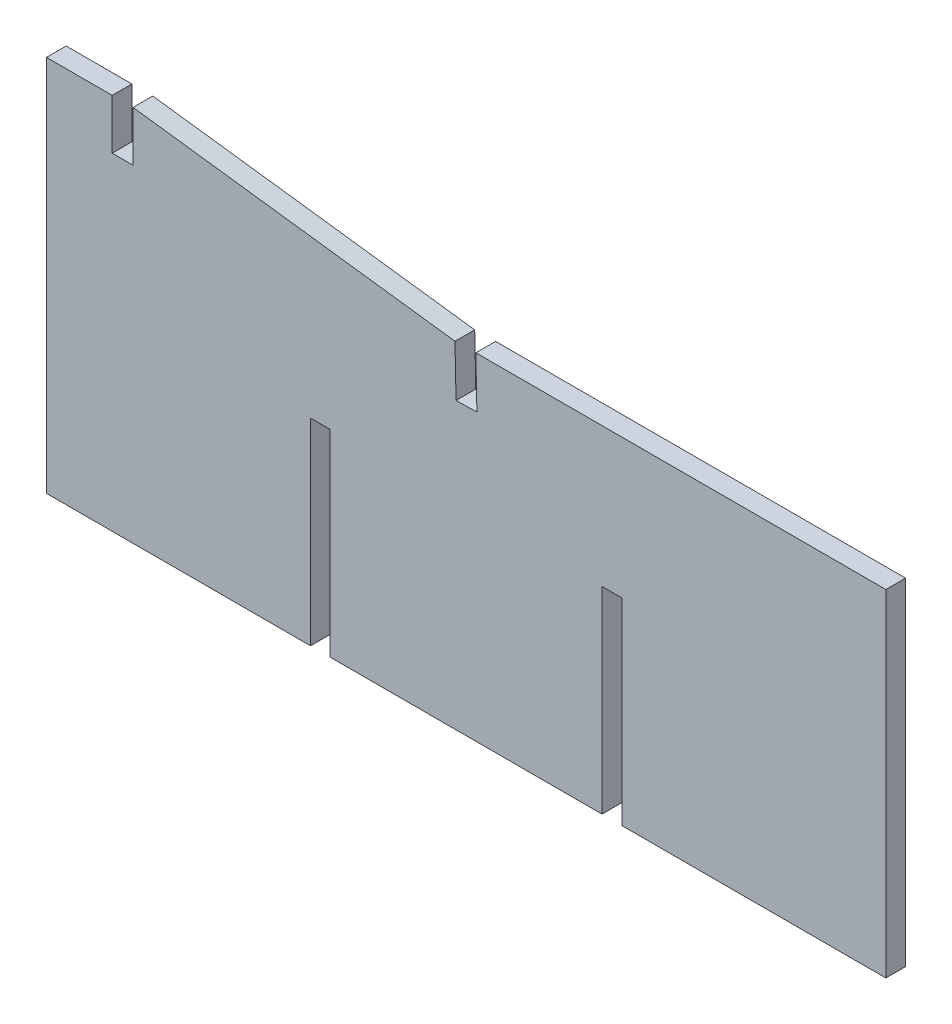
ISO-10303-21;
HEADER;
FILE_DESCRIPTION(('STEP AP214'),'2;1');
FILE_NAME('part.step','',(''),(''),'','','');
FILE_SCHEMA(('AUTOMOTIVE_DESIGN { 1 0 10303 214 1 1 1 1 }'));
ENDSEC;
DATA;
#1=APPLICATION_CONTEXT('core data for automotive mechanical design processes');
#2=APPLICATION_PROTOCOL_DEFINITION('international standard','automotive_design',2000,#1);
#3=PRODUCT_CONTEXT('',#1,'mechanical');
#4=PRODUCT('Part','Part','',(#3));
#5=PRODUCT_RELATED_PRODUCT_CATEGORY('part','',(#4));
#6=PRODUCT_DEFINITION_FORMATION('','',#4);
#7=PRODUCT_DEFINITION_CONTEXT('part definition',#1,'design');
#8=PRODUCT_DEFINITION('design','',#6,#7);
#9=PRODUCT_DEFINITION_SHAPE('','',#8);
#10=(LENGTH_UNIT() NAMED_UNIT(*) SI_UNIT(.MILLI.,.METRE.));
#11=(NAMED_UNIT(*) PLANE_ANGLE_UNIT() SI_UNIT($,.RADIAN.));
#12=(NAMED_UNIT(*) SI_UNIT($,.STERADIAN.) SOLID_ANGLE_UNIT());
#13=UNCERTAINTY_MEASURE_WITH_UNIT(LENGTH_MEASURE(1.E-05),#10,'distance_accuracy_value','');
#14=(GEOMETRIC_REPRESENTATION_CONTEXT(3) GLOBAL_UNCERTAINTY_ASSIGNED_CONTEXT((#13)) GLOBAL_UNIT_ASSIGNED_CONTEXT((#10,
#11,#12)) REPRESENTATION_CONTEXT('',''));
#15=CARTESIAN_POINT('',(0.,0.,0.));
#16=DIRECTION('',(0.,0.,1.));
#17=DIRECTION('',(1.,0.,0.));
#18=AXIS2_PLACEMENT_3D('',#15,#16,#17);
#19=CARTESIAN_POINT('',(256.67648980478,83.2463071232041,-193.));
#20=DIRECTION('',(0.,-1.,0.));
#21=DIRECTION('',(0.,0.,-1.));
#22=AXIS2_PLACEMENT_3D('',#19,#20,#21);
#23=PLANE('',#22);
#24=DIRECTION('',(-1.,0.,0.));
#25=VECTOR('',#24,1.);
#26=CARTESIAN_POINT('',(256.67648980478,83.2463071232041,-196.));
#27=LINE('',#26,#25);
#28=CARTESIAN_POINT('',(266.67648980478,83.2463071232041,-196.));
#29=VERTEX_POINT('',#28);
#30=CARTESIAN_POINT('',(256.67648980478,83.2463071232041,-196.));
#31=VERTEX_POINT('',#30);
#32=EDGE_CURVE('E201',#29,#31,#27,.T.);
#33=ORIENTED_EDGE('',*,*,#32,.T.);
#34=DIRECTION('',(0.,0.,-1.));
#35=VECTOR('',#34,1.);
#36=CARTESIAN_POINT('',(256.67648980478,83.2463071232041,-193.));
#37=LINE('',#36,#35);
#38=CARTESIAN_POINT('',(256.67648980478,83.2463071232041,-193.));
#39=VERTEX_POINT('',#38);
#40=EDGE_CURVE('E11',#39,#31,#37,.T.);
#41=ORIENTED_EDGE('',*,*,#40,.F.);
#42=DIRECTION('',(-1.,0.,0.));
#43=VECTOR('',#42,1.);
#44=CARTESIAN_POINT('',(256.67648980478,83.2463071232041,-193.));
#45=LINE('',#44,#43);
#46=CARTESIAN_POINT('',(266.67648980478,83.2463071232041,-193.));
#47=VERTEX_POINT('',#46);
#48=EDGE_CURVE('E239',#47,#39,#45,.T.);
#49=ORIENTED_EDGE('',*,*,#48,.F.);
#50=DIRECTION('',(0.,0.,-1.));
#51=VECTOR('',#50,1.);
#52=CARTESIAN_POINT('',(266.67648980478,83.2463071232041,-193.));
#53=LINE('',#52,#51);
#54=EDGE_CURVE('E197',#47,#29,#53,.T.);
#55=ORIENTED_EDGE('',*,*,#54,.T.);
#56=EDGE_LOOP('',(#33,#41,#49,#55));
#57=FACE_BOUND('',#56,.T.);
#58=ADVANCED_FACE('F33',(#57),#23,.F.);
#59=CARTESIAN_POINT('',(256.67648980478,25.8076428533385,-193.));
#60=DIRECTION('',(1.,0.,0.));
#61=DIRECTION('',(0.,0.,-1.));
#62=AXIS2_PLACEMENT_3D('',#59,#60,#61);
#63=PLANE('',#62);
#64=DIRECTION('',(0.,-1.,0.));
#65=VECTOR('',#64,1.);
#66=CARTESIAN_POINT('',(256.67648980478,25.8076428533385,-196.));
#67=LINE('',#66,#65);
#68=CARTESIAN_POINT('',(256.67648980478,25.8076428533385,-196.));
#69=VERTEX_POINT('',#68);
#70=EDGE_CURVE('E204',#31,#69,#67,.T.);
#71=ORIENTED_EDGE('',*,*,#70,.T.);
#72=DIRECTION('',(0.,0.,-1.));
#73=VECTOR('',#72,1.);
#74=CARTESIAN_POINT('',(256.67648980478,25.8076428533385,-193.));
#75=LINE('',#74,#73);
#76=CARTESIAN_POINT('',(256.67648980478,25.8076428533385,-193.));
#77=VERTEX_POINT('',#76);
#78=EDGE_CURVE('E41',#77,#69,#75,.T.);
#79=ORIENTED_EDGE('',*,*,#78,.F.);
#80=DIRECTION('',(0.,-1.,0.));
#81=VECTOR('',#80,1.);
#82=CARTESIAN_POINT('',(256.67648980478,25.8076428533385,-193.));
#83=LINE('',#82,#81);
#84=EDGE_CURVE('E128',#39,#77,#83,.T.);
#85=ORIENTED_EDGE('',*,*,#84,.F.);
#86=ORIENTED_EDGE('',*,*,#40,.T.);
#87=EDGE_LOOP('',(#71,#79,#85,#86));
#88=FACE_BOUND('',#87,.T.);
#89=ADVANCED_FACE('F357',(#88),#63,.F.);
#90=CARTESIAN_POINT('',(296.85148980478,25.8076428533385,-193.));
#91=DIRECTION('',(0.,1.,0.));
#92=DIRECTION('',(-1.,0.,0.));
#93=AXIS2_PLACEMENT_3D('',#90,#91,#92);
#94=PLANE('',#93);
#95=DIRECTION('',(1.,0.,0.));
#96=VECTOR('',#95,1.);
#97=CARTESIAN_POINT('',(296.85148980478,25.8076428533385,-196.));
#98=LINE('',#97,#96);
#99=CARTESIAN_POINT('',(296.85148980478,25.8076428533385,-196.));
#100=VERTEX_POINT('',#99);
#101=EDGE_CURVE('E206',#69,#100,#98,.T.);
#102=ORIENTED_EDGE('',*,*,#101,.T.);
#103=DIRECTION('',(0.,0.,-1.));
#104=VECTOR('',#103,1.);
#105=CARTESIAN_POINT('',(296.85148980478,25.8076428533385,-193.));
#106=LINE('',#105,#104);
#107=CARTESIAN_POINT('',(296.85148980478,25.8076428533385,-193.));
#108=VERTEX_POINT('',#107);
#109=EDGE_CURVE('E282',#108,#100,#106,.T.);
#110=ORIENTED_EDGE('',*,*,#109,.F.);
#111=DIRECTION('',(1.,0.,0.));
#112=VECTOR('',#111,1.);
#113=CARTESIAN_POINT('',(296.85148980478,25.8076428533385,-193.));
#114=LINE('',#113,#112);
#115=EDGE_CURVE('E290',#77,#108,#114,.T.);
#116=ORIENTED_EDGE('',*,*,#115,.F.);
#117=ORIENTED_EDGE('',*,*,#78,.T.);
#118=EDGE_LOOP('',(#102,#110,#116,#117));
#119=FACE_BOUND('',#118,.T.);
#120=ADVANCED_FACE('F288',(#119),#94,.F.);
#121=CARTESIAN_POINT('',(296.85148980478,25.8076428533385,-193.));
#122=DIRECTION('',(-1.,0.,0.));
#123=DIRECTION('',(0.,0.,1.));
#124=AXIS2_PLACEMENT_3D('',#121,#122,#123);
#125=PLANE('',#124);
#126=DIRECTION('',(0.,1.,0.));
#127=VECTOR('',#126,1.);
#128=CARTESIAN_POINT('',(296.85148980478,25.8076428533385,-196.));
#129=LINE('',#128,#127);
#130=CARTESIAN_POINT('',(296.85148980478,55.8076428533385,-196.));
#131=VERTEX_POINT('',#130);
#132=EDGE_CURVE('E208',#100,#131,#129,.T.);
#133=ORIENTED_EDGE('',*,*,#132,.T.);
#134=DIRECTION('',(0.,0.,-1.));
#135=VECTOR('',#134,1.);
#136=CARTESIAN_POINT('',(296.85148980478,55.8076428533385,-193.));
#137=LINE('',#136,#135);
#138=CARTESIAN_POINT('',(296.85148980478,55.8076428533385,-193.));
#139=VERTEX_POINT('',#138);
#140=EDGE_CURVE('E279',#139,#131,#137,.T.);
#141=ORIENTED_EDGE('',*,*,#140,.F.);
#142=DIRECTION('',(0.,1.,0.));
#143=VECTOR('',#142,1.);
#144=CARTESIAN_POINT('',(296.85148980478,25.8076428533385,-193.));
#145=LINE('',#144,#143);
#146=EDGE_CURVE('E308',#108,#139,#145,.T.);
#147=ORIENTED_EDGE('',*,*,#146,.F.);
#148=ORIENTED_EDGE('',*,*,#109,.T.);
#149=EDGE_LOOP('',(#133,#141,#147,#148));
#150=FACE_BOUND('',#149,.T.);
#151=ADVANCED_FACE('F299',(#150),#125,.F.);
#152=CARTESIAN_POINT('',(296.85148980478,55.8076428533385,-193.));
#153=DIRECTION('',(0.,1.,0.));
#154=DIRECTION('',(0.,0.,1.));
#155=AXIS2_PLACEMENT_3D('',#152,#153,#154);
#156=PLANE('',#155);
#157=DIRECTION('',(1.,0.,0.));
#158=VECTOR('',#157,1.);
#159=CARTESIAN_POINT('',(296.85148980478,55.8076428533385,-196.));
#160=LINE('',#159,#158);
#161=CARTESIAN_POINT('',(299.85148980478,55.8076428533385,-196.));
#162=VERTEX_POINT('',#161);
#163=EDGE_CURVE('E210',#131,#162,#160,.T.);
#164=ORIENTED_EDGE('',*,*,#163,.T.);
#165=DIRECTION('',(0.,0.,-1.));
#166=VECTOR('',#165,1.);
#167=CARTESIAN_POINT('',(299.85148980478,55.8076428533385,-193.));
#168=LINE('',#167,#166);
#169=CARTESIAN_POINT('',(299.85148980478,55.8076428533385,-193.));
#170=VERTEX_POINT('',#169);
#171=EDGE_CURVE('E276',#170,#162,#168,.T.);
#172=ORIENTED_EDGE('',*,*,#171,.F.);
#173=DIRECTION('',(1.,0.,0.));
#174=VECTOR('',#173,1.);
#175=CARTESIAN_POINT('',(296.85148980478,55.8076428533385,-193.));
#176=LINE('',#175,#174);
#177=EDGE_CURVE('E305',#139,#170,#176,.T.);
#178=ORIENTED_EDGE('',*,*,#177,.F.);
#179=ORIENTED_EDGE('',*,*,#140,.T.);
#180=EDGE_LOOP('',(#164,#172,#178,#179));
#181=FACE_BOUND('',#180,.T.);
#182=ADVANCED_FACE('F303',(#181),#156,.F.);
#183=CARTESIAN_POINT('',(299.85148980478,55.8076428533385,-193.));
#184=DIRECTION('',(1.,0.,0.));
#185=DIRECTION('',(0.,0.,-1.));
#186=AXIS2_PLACEMENT_3D('',#183,#184,#185);
#187=PLANE('',#186);
#188=DIRECTION('',(0.,-1.,0.));
#189=VECTOR('',#188,1.);
#190=CARTESIAN_POINT('',(299.85148980478,55.8076428533385,-196.));
#191=LINE('',#190,#189);
#192=CARTESIAN_POINT('',(299.85148980478,25.8076428533385,-196.));
#193=VERTEX_POINT('',#192);
#194=EDGE_CURVE('E212',#162,#193,#191,.T.);
#195=ORIENTED_EDGE('',*,*,#194,.T.);
#196=DIRECTION('',(0.,0.,-1.));
#197=VECTOR('',#196,1.);
#198=CARTESIAN_POINT('',(299.85148980478,25.8076428533385,-193.));
#199=LINE('',#198,#197);
#200=CARTESIAN_POINT('',(299.85148980478,25.8076428533385,-193.));
#201=VERTEX_POINT('',#200);
#202=EDGE_CURVE('E273',#201,#193,#199,.T.);
#203=ORIENTED_EDGE('',*,*,#202,.F.);
#204=DIRECTION('',(0.,-1.,0.));
#205=VECTOR('',#204,1.);
#206=CARTESIAN_POINT('',(299.85148980478,55.8076428533385,-193.));
#207=LINE('',#206,#205);
#208=EDGE_CURVE('E307',#170,#201,#207,.T.);
#209=ORIENTED_EDGE('',*,*,#208,.F.);
#210=ORIENTED_EDGE('',*,*,#171,.T.);
#211=EDGE_LOOP('',(#195,#203,#209,#210));
#212=FACE_BOUND('',#211,.T.);
#213=ADVANCED_FACE('F370',(#212),#187,.F.);
#214=CARTESIAN_POINT('',(341.19748980478,25.8076428533385,-193.));
#215=DIRECTION('',(0.,1.,0.));
#216=DIRECTION('',(-1.,0.,0.));
#217=AXIS2_PLACEMENT_3D('',#214,#215,#216);
#218=PLANE('',#217);
#219=DIRECTION('',(1.,0.,0.));
#220=VECTOR('',#219,1.);
#221=CARTESIAN_POINT('',(341.19748980478,25.8076428533385,-196.));
#222=LINE('',#221,#220);
#223=CARTESIAN_POINT('',(341.19748980478,25.8076428533385,-196.));
#224=VERTEX_POINT('',#223);
#225=EDGE_CURVE('E214',#193,#224,#222,.T.);
#226=ORIENTED_EDGE('',*,*,#225,.T.);
#227=DIRECTION('',(0.,0.,-1.));
#228=VECTOR('',#227,1.);
#229=CARTESIAN_POINT('',(341.19748980478,25.8076428533385,-193.));
#230=LINE('',#229,#228);
#231=CARTESIAN_POINT('',(341.19748980478,25.8076428533385,-193.));
#232=VERTEX_POINT('',#231);
#233=EDGE_CURVE('E270',#232,#224,#230,.T.);
#234=ORIENTED_EDGE('',*,*,#233,.F.);
#235=DIRECTION('',(1.,0.,0.));
#236=VECTOR('',#235,1.);
#237=CARTESIAN_POINT('',(341.19748980478,25.8076428533385,-193.));
#238=LINE('',#237,#236);
#239=EDGE_CURVE('E310',#201,#232,#238,.T.);
#240=ORIENTED_EDGE('',*,*,#239,.F.);
#241=ORIENTED_EDGE('',*,*,#202,.T.);
#242=EDGE_LOOP('',(#226,#234,#240,#241));
#243=FACE_BOUND('',#242,.T.);
#244=ADVANCED_FACE('F373',(#243),#218,.F.);
#245=CARTESIAN_POINT('',(341.19748980478,25.8076428533385,-193.));
#246=DIRECTION('',(-1.,0.,0.));
#247=DIRECTION('',(0.,0.,1.));
#248=AXIS2_PLACEMENT_3D('',#245,#246,#247);
#249=PLANE('',#248);
#250=DIRECTION('',(0.,1.,0.));
#251=VECTOR('',#250,1.);
#252=CARTESIAN_POINT('',(341.19748980478,25.8076428533385,-196.));
#253=LINE('',#252,#251);
#254=CARTESIAN_POINT('',(341.19748980478,55.8076428533385,-196.));
#255=VERTEX_POINT('',#254);
#256=EDGE_CURVE('E216',#224,#255,#253,.T.);
#257=ORIENTED_EDGE('',*,*,#256,.T.);
#258=DIRECTION('',(0.,0.,-1.));
#259=VECTOR('',#258,1.);
#260=CARTESIAN_POINT('',(341.19748980478,55.8076428533385,-193.));
#261=LINE('',#260,#259);
#262=CARTESIAN_POINT('',(341.19748980478,55.8076428533385,-193.));
#263=VERTEX_POINT('',#262);
#264=EDGE_CURVE('E267',#263,#255,#261,.T.);
#265=ORIENTED_EDGE('',*,*,#264,.F.);
#266=DIRECTION('',(0.,1.,0.));
#267=VECTOR('',#266,1.);
#268=CARTESIAN_POINT('',(341.19748980478,25.8076428533385,-193.));
#269=LINE('',#268,#267);
#270=EDGE_CURVE('E316',#232,#263,#269,.T.);
#271=ORIENTED_EDGE('',*,*,#270,.F.);
#272=ORIENTED_EDGE('',*,*,#233,.T.);
#273=EDGE_LOOP('',(#257,#265,#271,#272));
#274=FACE_BOUND('',#273,.T.);
#275=ADVANCED_FACE('F377',(#274),#249,.F.);
#276=CARTESIAN_POINT('',(341.19748980478,55.8076428533385,-193.));
#277=DIRECTION('',(0.,1.,0.));
#278=DIRECTION('',(0.,0.,1.));
#279=AXIS2_PLACEMENT_3D('',#276,#277,#278);
#280=PLANE('',#279);
#281=DIRECTION('',(1.,0.,0.));
#282=VECTOR('',#281,1.);
#283=CARTESIAN_POINT('',(341.19748980478,55.8076428533385,-196.));
#284=LINE('',#283,#282);
#285=CARTESIAN_POINT('',(344.19748980478,55.8076428533385,-196.));
#286=VERTEX_POINT('',#285);
#287=EDGE_CURVE('E218',#255,#286,#284,.T.);
#288=ORIENTED_EDGE('',*,*,#287,.T.);
#289=DIRECTION('',(0.,0.,-1.));
#290=VECTOR('',#289,1.);
#291=CARTESIAN_POINT('',(344.19748980478,55.8076428533385,-193.));
#292=LINE('',#291,#290);
#293=CARTESIAN_POINT('',(344.19748980478,55.8076428533385,-193.));
#294=VERTEX_POINT('',#293);
#295=EDGE_CURVE('E264',#294,#286,#292,.T.);
#296=ORIENTED_EDGE('',*,*,#295,.F.);
#297=DIRECTION('',(1.,0.,0.));
#298=VECTOR('',#297,1.);
#299=CARTESIAN_POINT('',(341.19748980478,55.8076428533385,-193.));
#300=LINE('',#299,#298);
#301=EDGE_CURVE('E318',#263,#294,#300,.T.);
#302=ORIENTED_EDGE('',*,*,#301,.F.);
#303=ORIENTED_EDGE('',*,*,#264,.T.);
#304=EDGE_LOOP('',(#288,#296,#302,#303));
#305=FACE_BOUND('',#304,.T.);
#306=ADVANCED_FACE('F381',(#305),#280,.F.);
#307=CARTESIAN_POINT('',(344.19748980478,55.8076428533385,-193.));
#308=DIRECTION('',(1.,0.,0.));
#309=DIRECTION('',(0.,0.,-1.));
#310=AXIS2_PLACEMENT_3D('',#307,#308,#309);
#311=PLANE('',#310);
#312=DIRECTION('',(0.,-1.,0.));
#313=VECTOR('',#312,1.);
#314=CARTESIAN_POINT('',(344.19748980478,55.8076428533385,-196.));
#315=LINE('',#314,#313);
#316=CARTESIAN_POINT('',(344.19748980478,25.8076428533385,-196.));
#317=VERTEX_POINT('',#316);
#318=EDGE_CURVE('E220',#286,#317,#315,.T.);
#319=ORIENTED_EDGE('',*,*,#318,.T.);
#320=DIRECTION('',(0.,0.,-1.));
#321=VECTOR('',#320,1.);
#322=CARTESIAN_POINT('',(344.19748980478,25.8076428533385,-193.));
#323=LINE('',#322,#321);
#324=CARTESIAN_POINT('',(344.19748980478,25.8076428533385,-193.));
#325=VERTEX_POINT('',#324);
#326=EDGE_CURVE('E261',#325,#317,#323,.T.);
#327=ORIENTED_EDGE('',*,*,#326,.F.);
#328=DIRECTION('',(0.,-1.,0.));
#329=VECTOR('',#328,1.);
#330=CARTESIAN_POINT('',(344.19748980478,55.8076428533385,-193.));
#331=LINE('',#330,#329);
#332=EDGE_CURVE('E320',#294,#325,#331,.T.);
#333=ORIENTED_EDGE('',*,*,#332,.F.);
#334=ORIENTED_EDGE('',*,*,#295,.T.);
#335=EDGE_LOOP('',(#319,#327,#333,#334));
#336=FACE_BOUND('',#335,.T.);
#337=ADVANCED_FACE('F385',(#336),#311,.F.);
#338=CARTESIAN_POINT('',(384.37248980478,25.8076428533385,-193.));
#339=DIRECTION('',(0.,1.,0.));
#340=DIRECTION('',(-1.,0.,0.));
#341=AXIS2_PLACEMENT_3D('',#338,#339,#340);
#342=PLANE('',#341);
#343=DIRECTION('',(1.,0.,0.));
#344=VECTOR('',#343,1.);
#345=CARTESIAN_POINT('',(384.37248980478,25.8076428533385,-196.));
#346=LINE('',#345,#344);
#347=CARTESIAN_POINT('',(384.37248980478,25.8076428533385,-196.));
#348=VERTEX_POINT('',#347);
#349=EDGE_CURVE('E222',#317,#348,#346,.T.);
#350=ORIENTED_EDGE('',*,*,#349,.T.);
#351=DIRECTION('',(0.,0.,-1.));
#352=VECTOR('',#351,1.);
#353=CARTESIAN_POINT('',(384.37248980478,25.8076428533385,-193.));
#354=LINE('',#353,#352);
#355=CARTESIAN_POINT('',(384.37248980478,25.8076428533385,-193.));
#356=VERTEX_POINT('',#355);
#357=EDGE_CURVE('E258',#356,#348,#354,.T.);
#358=ORIENTED_EDGE('',*,*,#357,.F.);
#359=DIRECTION('',(1.,0.,0.));
#360=VECTOR('',#359,1.);
#361=CARTESIAN_POINT('',(384.37248980478,25.8076428533385,-193.));
#362=LINE('',#361,#360);
#363=EDGE_CURVE('E322',#325,#356,#362,.T.);
#364=ORIENTED_EDGE('',*,*,#363,.F.);
#365=ORIENTED_EDGE('',*,*,#326,.T.);
#366=EDGE_LOOP('',(#350,#358,#364,#365));
#367=FACE_BOUND('',#366,.T.);
#368=ADVANCED_FACE('F389',(#367),#342,.F.);
#369=CARTESIAN_POINT('',(384.37248980478,76.9918433876097,-193.));
#370=DIRECTION('',(-1.,0.,0.));
#371=DIRECTION('',(0.,0.,1.));
#372=AXIS2_PLACEMENT_3D('',#369,#370,#371);
#373=PLANE('',#372);
#374=DIRECTION('',(0.,1.,0.));
#375=VECTOR('',#374,1.);
#376=CARTESIAN_POINT('',(384.37248980478,76.9918433876097,-196.));
#377=LINE('',#376,#375);
#378=CARTESIAN_POINT('',(384.37248980478,76.9918433876097,-196.));
#379=VERTEX_POINT('',#378);
#380=EDGE_CURVE('E224',#348,#379,#377,.T.);
#381=ORIENTED_EDGE('',*,*,#380,.T.);
#382=DIRECTION('',(0.,0.,-1.));
#383=VECTOR('',#382,1.);
#384=CARTESIAN_POINT('',(384.37248980478,76.9918433876097,-193.));
#385=LINE('',#384,#383);
#386=CARTESIAN_POINT('',(384.37248980478,76.9918433876097,-193.));
#387=VERTEX_POINT('',#386);
#388=EDGE_CURVE('E255',#387,#379,#385,.T.);
#389=ORIENTED_EDGE('',*,*,#388,.F.);
#390=DIRECTION('',(0.,1.,0.));
#391=VECTOR('',#390,1.);
#392=CARTESIAN_POINT('',(384.37248980478,76.9918433876097,-193.));
#393=LINE('',#392,#391);
#394=EDGE_CURVE('E324',#356,#387,#393,.T.);
#395=ORIENTED_EDGE('',*,*,#394,.F.);
#396=ORIENTED_EDGE('',*,*,#357,.T.);
#397=EDGE_LOOP('',(#381,#389,#395,#396));
#398=FACE_BOUND('',#397,.T.);
#399=ADVANCED_FACE('F393',(#398),#373,.F.);
#400=CARTESIAN_POINT('',(322.001481343776,76.9918433876097,-193.));
#401=DIRECTION('',(0.,-1.,0.));
#402=DIRECTION('',(0.,0.,-1.));
#403=AXIS2_PLACEMENT_3D('',#400,#401,#402);
#404=PLANE('',#403);
#405=DIRECTION('',(-1.,0.,0.));
#406=VECTOR('',#405,1.);
#407=CARTESIAN_POINT('',(322.001481343776,76.9918433876097,-196.));
#408=LINE('',#407,#406);
#409=CARTESIAN_POINT('',(322.001481343776,76.9918433876097,-196.));
#410=VERTEX_POINT('',#409);
#411=EDGE_CURVE('E226',#379,#410,#408,.T.);
#412=ORIENTED_EDGE('',*,*,#411,.T.);
#413=DIRECTION('',(0.,0.,-1.));
#414=VECTOR('',#413,1.);
#415=CARTESIAN_POINT('',(322.001481343776,76.9918433876097,-193.));
#416=LINE('',#415,#414);
#417=CARTESIAN_POINT('',(322.001481343776,76.9918433876097,-193.));
#418=VERTEX_POINT('',#417);
#419=EDGE_CURVE('E252',#418,#410,#416,.T.);
#420=ORIENTED_EDGE('',*,*,#419,.F.);
#421=DIRECTION('',(-1.,0.,0.));
#422=VECTOR('',#421,1.);
#423=CARTESIAN_POINT('',(322.001481343776,76.9918433876097,-193.));
#424=LINE('',#423,#422);
#425=EDGE_CURVE('E326',#387,#418,#424,.T.);
#426=ORIENTED_EDGE('',*,*,#425,.F.);
#427=ORIENTED_EDGE('',*,*,#388,.T.);
#428=EDGE_LOOP('',(#412,#420,#426,#427));
#429=FACE_BOUND('',#428,.T.);
#430=ADVANCED_FACE('F397',(#429),#404,.F.);
#431=CARTESIAN_POINT('',(322.001481343776,76.9918433876097,-193.));
#432=DIRECTION('',(0.999785281482576,0.0207217501868405,0.));
#433=DIRECTION('',(-0.0207217501868405,0.999785281482576,0.));
#434=AXIS2_PLACEMENT_3D('',#431,#432,#433);
#435=PLANE('',#434);
#436=DIRECTION('',(0.0207217501868405,-0.999785281482576,0.));
#437=VECTOR('',#436,1.);
#438=CARTESIAN_POINT('',(322.001481343776,76.9918433876097,-196.));
#439=LINE('',#438,#437);
#440=CARTESIAN_POINT('',(322.161541781307,69.2692297980851,-196.));
#441=VERTEX_POINT('',#440);
#442=EDGE_CURVE('E228',#410,#441,#439,.T.);
#443=ORIENTED_EDGE('',*,*,#442,.T.);
#444=DIRECTION('',(0.,0.,-1.));
#445=VECTOR('',#444,1.);
#446=CARTESIAN_POINT('',(322.161541781307,69.2692297980851,-193.));
#447=LINE('',#446,#445);
#448=CARTESIAN_POINT('',(322.161541781307,69.2692297980851,-193.));
#449=VERTEX_POINT('',#448);
#450=EDGE_CURVE('E249',#449,#441,#447,.T.);
#451=ORIENTED_EDGE('',*,*,#450,.F.);
#452=DIRECTION('',(0.0207217501868405,-0.999785281482576,0.));
#453=VECTOR('',#452,1.);
#454=CARTESIAN_POINT('',(322.001481343776,76.9918433876097,-193.));
#455=LINE('',#454,#453);
#456=EDGE_CURVE('E328',#418,#449,#455,.T.);
#457=ORIENTED_EDGE('',*,*,#456,.F.);
#458=ORIENTED_EDGE('',*,*,#419,.T.);
#459=EDGE_LOOP('',(#443,#451,#457,#458));
#460=FACE_BOUND('',#459,.T.);
#461=ADVANCED_FACE('F401',(#460),#435,.F.);
#462=CARTESIAN_POINT('',(318.987231092723,69.2030067243944,-193.));
#463=DIRECTION('',(0.0208576518563563,-0.999782455516718,0.));
#464=DIRECTION('',(0.999782455516719,0.0208576518563563,0.));
#465=AXIS2_PLACEMENT_3D('',#462,#463,#464);
#466=PLANE('',#465);
#467=DIRECTION('',(-0.999782455516718,-0.0208576518563563,0.));
#468=VECTOR('',#467,1.);
#469=CARTESIAN_POINT('',(318.987231092723,69.2030067243944,-196.));
#470=LINE('',#469,#468);
#471=CARTESIAN_POINT('',(318.987231092723,69.2030067243944,-196.));
#472=VERTEX_POINT('',#471);
#473=EDGE_CURVE('E230',#441,#472,#470,.T.);
#474=ORIENTED_EDGE('',*,*,#473,.T.);
#475=DIRECTION('',(0.,0.,-1.));
#476=VECTOR('',#475,1.);
#477=CARTESIAN_POINT('',(318.987231092723,69.2030067243944,-193.));
#478=LINE('',#477,#476);
#479=CARTESIAN_POINT('',(318.987231092723,69.2030067243944,-193.));
#480=VERTEX_POINT('',#479);
#481=EDGE_CURVE('E246',#480,#472,#478,.T.);
#482=ORIENTED_EDGE('',*,*,#481,.F.);
#483=DIRECTION('',(-0.999782455516718,-0.0208576518563563,0.));
#484=VECTOR('',#483,1.);
#485=CARTESIAN_POINT('',(318.987231092723,69.2030067243944,-193.));
#486=LINE('',#485,#484);
#487=EDGE_CURVE('E330',#449,#480,#486,.T.);
#488=ORIENTED_EDGE('',*,*,#487,.F.);
#489=ORIENTED_EDGE('',*,*,#450,.T.);
#490=EDGE_LOOP('',(#474,#482,#488,#489));
#491=FACE_BOUND('',#490,.T.);
#492=ADVANCED_FACE('F405',(#491),#466,.F.);
#493=CARTESIAN_POINT('',(318.827170369306,76.9256341074243,-193.));
#494=DIRECTION('',(-0.999785281482579,-0.0207217501866855,0.));
#495=DIRECTION('',(0.0207217501866855,-0.99978528148258,0.));
#496=AXIS2_PLACEMENT_3D('',#493,#494,#495);
#497=PLANE('',#496);
#498=DIRECTION('',(-0.0207217501866855,0.999785281482579,0.));
#499=VECTOR('',#498,1.);
#500=CARTESIAN_POINT('',(318.827170369306,76.9256341074243,-196.));
#501=LINE('',#500,#499);
#502=CARTESIAN_POINT('',(318.827170369306,76.9256341074243,-196.));
#503=VERTEX_POINT('',#502);
#504=EDGE_CURVE('E232',#472,#503,#501,.T.);
#505=ORIENTED_EDGE('',*,*,#504,.T.);
#506=DIRECTION('',(0.,0.,-1.));
#507=VECTOR('',#506,1.);
#508=CARTESIAN_POINT('',(318.827170369306,76.9256341074243,-193.));
#509=LINE('',#508,#507);
#510=CARTESIAN_POINT('',(318.827170369306,76.9256341074243,-193.));
#511=VERTEX_POINT('',#510);
#512=EDGE_CURVE('E243',#511,#503,#509,.T.);
#513=ORIENTED_EDGE('',*,*,#512,.F.);
#514=DIRECTION('',(-0.0207217501866855,0.999785281482579,0.));
#515=VECTOR('',#514,1.);
#516=CARTESIAN_POINT('',(318.827170369306,76.9256341074243,-193.));
#517=LINE('',#516,#515);
#518=EDGE_CURVE('E332',#480,#511,#517,.T.);
#519=ORIENTED_EDGE('',*,*,#518,.F.);
#520=ORIENTED_EDGE('',*,*,#481,.T.);
#521=EDGE_LOOP('',(#505,#513,#519,#520));
#522=FACE_BOUND('',#521,.T.);
#523=ADVANCED_FACE('F338',(#522),#497,.F.);
#524=CARTESIAN_POINT('',(269.85148980478,83.246308539053,-193.));
#525=DIRECTION('',(-0.127995873031724,-0.991774700467221,0.));
#526=DIRECTION('',(0.991774700467221,-0.127995873031724,0.));
#527=AXIS2_PLACEMENT_3D('',#524,#525,#526);
#528=PLANE('',#527);
#529=DIRECTION('',(-0.991774700467221,0.127995873031724,0.));
#530=VECTOR('',#529,1.);
#531=CARTESIAN_POINT('',(269.85148980478,83.246308539053,-196.));
#532=LINE('',#531,#530);
#533=CARTESIAN_POINT('',(269.85148980478,83.246308539053,-196.));
#534=VERTEX_POINT('',#533);
#535=EDGE_CURVE('E234',#503,#534,#532,.T.);
#536=ORIENTED_EDGE('',*,*,#535,.T.);
#537=DIRECTION('',(0.,0.,-1.));
#538=VECTOR('',#537,1.);
#539=CARTESIAN_POINT('',(269.85148980478,83.246308539053,-193.));
#540=LINE('',#539,#538);
#541=CARTESIAN_POINT('',(269.85148980478,83.246308539053,-193.));
#542=VERTEX_POINT('',#541);
#543=EDGE_CURVE('E192',#542,#534,#540,.T.);
#544=ORIENTED_EDGE('',*,*,#543,.F.);
#545=DIRECTION('',(-0.991774700467221,0.127995873031724,0.));
#546=VECTOR('',#545,1.);
#547=CARTESIAN_POINT('',(269.85148980478,83.246308539053,-193.));
#548=LINE('',#547,#546);
#549=EDGE_CURVE('E183',#511,#542,#548,.T.);
#550=ORIENTED_EDGE('',*,*,#549,.F.);
#551=ORIENTED_EDGE('',*,*,#512,.T.);
#552=EDGE_LOOP('',(#536,#544,#550,#551));
#553=FACE_BOUND('',#552,.T.);
#554=ADVANCED_FACE('F342',(#553),#528,.F.);
#555=CARTESIAN_POINT('',(269.85148980478,83.246308539053,-193.));
#556=DIRECTION('',(1.,0.,0.));
#557=DIRECTION('',(0.,0.,-1.));
#558=AXIS2_PLACEMENT_3D('',#555,#556,#557);
#559=PLANE('',#558);
#560=DIRECTION('',(0.,-1.,0.));
#561=VECTOR('',#560,1.);
#562=CARTESIAN_POINT('',(269.85148980478,83.246308539053,-196.));
#563=LINE('',#562,#561);
#564=CARTESIAN_POINT('',(269.85148980478,75.6255584337503,-196.));
#565=VERTEX_POINT('',#564);
#566=EDGE_CURVE('E191',#534,#565,#563,.T.);
#567=ORIENTED_EDGE('',*,*,#566,.T.);
#568=DIRECTION('',(0.,0.,-1.));
#569=VECTOR('',#568,1.);
#570=CARTESIAN_POINT('',(269.85148980478,75.6255584337503,-193.));
#571=LINE('',#570,#569);
#572=CARTESIAN_POINT('',(269.85148980478,75.6255584337503,-193.));
#573=VERTEX_POINT('',#572);
#574=EDGE_CURVE('E188',#573,#565,#571,.T.);
#575=ORIENTED_EDGE('',*,*,#574,.F.);
#576=DIRECTION('',(0.,-1.,0.));
#577=VECTOR('',#576,1.);
#578=CARTESIAN_POINT('',(269.85148980478,83.246308539053,-193.));
#579=LINE('',#578,#577);
#580=EDGE_CURVE('E177',#542,#573,#579,.T.);
#581=ORIENTED_EDGE('',*,*,#580,.F.);
#582=ORIENTED_EDGE('',*,*,#543,.T.);
#583=EDGE_LOOP('',(#567,#575,#581,#582));
#584=FACE_BOUND('',#583,.T.);
#585=ADVANCED_FACE('F189',(#584),#559,.F.);
#586=CARTESIAN_POINT('',(266.67648980478,75.6255584337503,-193.));
#587=DIRECTION('',(0.,-1.,0.));
#588=DIRECTION('',(0.,0.,-1.));
#589=AXIS2_PLACEMENT_3D('',#586,#587,#588);
#590=PLANE('',#589);
#591=DIRECTION('',(-1.,0.,0.));
#592=VECTOR('',#591,1.);
#593=CARTESIAN_POINT('',(266.67648980478,75.6255584337503,-196.));
#594=LINE('',#593,#592);
#595=CARTESIAN_POINT('',(266.67648980478,75.6255584337503,-196.));
#596=VERTEX_POINT('',#595);
#597=EDGE_CURVE('E114',#565,#596,#594,.T.);
#598=ORIENTED_EDGE('',*,*,#597,.T.);
#599=DIRECTION('',(0.,0.,-1.));
#600=VECTOR('',#599,1.);
#601=CARTESIAN_POINT('',(266.67648980478,75.6255584337503,-193.));
#602=LINE('',#601,#600);
#603=CARTESIAN_POINT('',(266.67648980478,75.6255584337503,-193.));
#604=VERTEX_POINT('',#603);
#605=EDGE_CURVE('E193',#604,#596,#602,.T.);
#606=ORIENTED_EDGE('',*,*,#605,.F.);
#607=DIRECTION('',(-1.,0.,0.));
#608=VECTOR('',#607,1.);
#609=CARTESIAN_POINT('',(266.67648980478,75.6255584337503,-193.));
#610=LINE('',#609,#608);
#611=EDGE_CURVE('E181',#573,#604,#610,.T.);
#612=ORIENTED_EDGE('',*,*,#611,.F.);
#613=ORIENTED_EDGE('',*,*,#574,.T.);
#614=EDGE_LOOP('',(#598,#606,#612,#613));
#615=FACE_BOUND('',#614,.T.);
#616=ADVANCED_FACE('F195',(#615),#590,.F.);
#617=CARTESIAN_POINT('',(266.67648980478,83.2463071232041,-193.));
#618=DIRECTION('',(-1.,0.,0.));
#619=DIRECTION('',(0.,-1.,0.));
#620=AXIS2_PLACEMENT_3D('',#617,#618,#619);
#621=PLANE('',#620);
#622=DIRECTION('',(0.,1.,0.));
#623=VECTOR('',#622,1.);
#624=CARTESIAN_POINT('',(266.67648980478,83.2463071232041,-196.));
#625=LINE('',#624,#623);
#626=EDGE_CURVE('E120',#596,#29,#625,.T.);
#627=ORIENTED_EDGE('',*,*,#626,.T.);
#628=ORIENTED_EDGE('',*,*,#54,.F.);
#629=DIRECTION('',(0.,1.,0.));
#630=VECTOR('',#629,1.);
#631=CARTESIAN_POINT('',(266.67648980478,83.2463071232041,-193.));
#632=LINE('',#631,#630);
#633=EDGE_CURVE('E49',#604,#47,#632,.T.);
#634=ORIENTED_EDGE('',*,*,#633,.F.);
#635=ORIENTED_EDGE('',*,*,#605,.T.);
#636=EDGE_LOOP('',(#627,#628,#634,#635));
#637=FACE_BOUND('',#636,.T.);
#638=ADVANCED_FACE('F346',(#637),#621,.F.);
#639=CARTESIAN_POINT('',(0.,0.,-193.));
#640=DIRECTION('',(0.,0.,-1.));
#641=DIRECTION('',(-1.,0.,0.));
#642=AXIS2_PLACEMENT_3D('',#639,#640,#641);
#643=PLANE('',#642);
#644=ORIENTED_EDGE('',*,*,#48,.T.);
#645=ORIENTED_EDGE('',*,*,#84,.T.);
#646=ORIENTED_EDGE('',*,*,#115,.T.);
#647=ORIENTED_EDGE('',*,*,#146,.T.);
#648=ORIENTED_EDGE('',*,*,#177,.T.);
#649=ORIENTED_EDGE('',*,*,#208,.T.);
#650=ORIENTED_EDGE('',*,*,#239,.T.);
#651=ORIENTED_EDGE('',*,*,#270,.T.);
#652=ORIENTED_EDGE('',*,*,#301,.T.);
#653=ORIENTED_EDGE('',*,*,#332,.T.);
#654=ORIENTED_EDGE('',*,*,#363,.T.);
#655=ORIENTED_EDGE('',*,*,#394,.T.);
#656=ORIENTED_EDGE('',*,*,#425,.T.);
#657=ORIENTED_EDGE('',*,*,#456,.T.);
#658=ORIENTED_EDGE('',*,*,#487,.T.);
#659=ORIENTED_EDGE('',*,*,#518,.T.);
#660=ORIENTED_EDGE('',*,*,#549,.T.);
#661=ORIENTED_EDGE('',*,*,#580,.T.);
#662=ORIENTED_EDGE('',*,*,#611,.T.);
#663=ORIENTED_EDGE('',*,*,#633,.T.);
#664=EDGE_LOOP('',(#644,#645,#646,#647,#648,#649,#650,#651,#652,#653,#654,#655,#656,#657,#658,
#659,#660,#661,#662,#663));
#665=FACE_BOUND('',#664,.T.);
#666=ADVANCED_FACE('F179',(#665),#643,.F.);
#667=CARTESIAN_POINT('',(0.,0.,-196.));
#668=DIRECTION('',(0.,0.,-1.));
#669=DIRECTION('',(-1.,0.,0.));
#670=AXIS2_PLACEMENT_3D('',#667,#668,#669);
#671=PLANE('',#670);
#672=ORIENTED_EDGE('',*,*,#32,.F.);
#673=ORIENTED_EDGE('',*,*,#626,.F.);
#674=ORIENTED_EDGE('',*,*,#597,.F.);
#675=ORIENTED_EDGE('',*,*,#566,.F.);
#676=ORIENTED_EDGE('',*,*,#535,.F.);
#677=ORIENTED_EDGE('',*,*,#504,.F.);
#678=ORIENTED_EDGE('',*,*,#473,.F.);
#679=ORIENTED_EDGE('',*,*,#442,.F.);
#680=ORIENTED_EDGE('',*,*,#411,.F.);
#681=ORIENTED_EDGE('',*,*,#380,.F.);
#682=ORIENTED_EDGE('',*,*,#349,.F.);
#683=ORIENTED_EDGE('',*,*,#318,.F.);
#684=ORIENTED_EDGE('',*,*,#287,.F.);
#685=ORIENTED_EDGE('',*,*,#256,.F.);
#686=ORIENTED_EDGE('',*,*,#225,.F.);
#687=ORIENTED_EDGE('',*,*,#194,.F.);
#688=ORIENTED_EDGE('',*,*,#163,.F.);
#689=ORIENTED_EDGE('',*,*,#132,.F.);
#690=ORIENTED_EDGE('',*,*,#101,.F.);
#691=ORIENTED_EDGE('',*,*,#70,.F.);
#692=EDGE_LOOP('',(#672,#673,#674,#675,#676,#677,#678,#679,#680,#681,#682,#683,#684,#685,#686,
#687,#688,#689,#690,#691));
#693=FACE_BOUND('',#692,.T.);
#694=ADVANCED_FACE('F294',(#693),#671,.T.);
#695=CLOSED_SHELL('',(#58,#89,#120,#151,#182,#213,#244,#275,#306,#337,#368,#399,#430,#461,#492,
#523,#554,#585,#616,#638,#666,#694));
#696=MANIFOLD_SOLID_BREP('B2',#695);
#697=ADVANCED_BREP_SHAPE_REPRESENTATION('',(#18,#696),#14);
#698=SHAPE_DEFINITION_REPRESENTATION(#9,#697);
ENDSEC;
END-ISO-10303-21;
